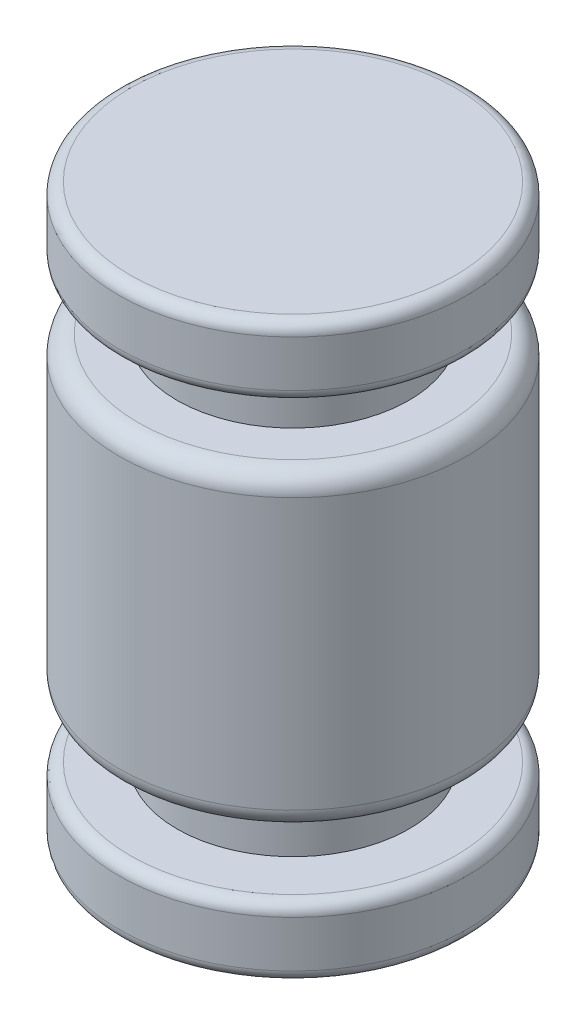
ISO-10303-21;
HEADER;
FILE_DESCRIPTION(('STEP AP214'),'2;1');
FILE_NAME('part.step','',(''),(''),'','','');
FILE_SCHEMA(('AUTOMOTIVE_DESIGN { 1 0 10303 214 1 1 1 1 }'));
ENDSEC;
DATA;
#1=APPLICATION_CONTEXT('core data for automotive mechanical design processes');
#2=APPLICATION_PROTOCOL_DEFINITION('international standard','automotive_design',2000,#1);
#3=PRODUCT_CONTEXT('',#1,'mechanical');
#4=PRODUCT('Part','Part','',(#3));
#5=PRODUCT_RELATED_PRODUCT_CATEGORY('part','',(#4));
#6=PRODUCT_DEFINITION_FORMATION('','',#4);
#7=PRODUCT_DEFINITION_CONTEXT('part definition',#1,'design');
#8=PRODUCT_DEFINITION('design','',#6,#7);
#9=PRODUCT_DEFINITION_SHAPE('','',#8);
#10=(LENGTH_UNIT() NAMED_UNIT(*) SI_UNIT(.MILLI.,.METRE.));
#11=(NAMED_UNIT(*) PLANE_ANGLE_UNIT() SI_UNIT($,.RADIAN.));
#12=(NAMED_UNIT(*) SI_UNIT($,.STERADIAN.) SOLID_ANGLE_UNIT());
#13=UNCERTAINTY_MEASURE_WITH_UNIT(LENGTH_MEASURE(1.E-05),#10,'distance_accuracy_value','');
#14=(GEOMETRIC_REPRESENTATION_CONTEXT(3) GLOBAL_UNCERTAINTY_ASSIGNED_CONTEXT((#13)) GLOBAL_UNIT_ASSIGNED_CONTEXT((#10,
#11,#12)) REPRESENTATION_CONTEXT('',''));
#15=CARTESIAN_POINT('',(0.,0.,0.));
#16=DIRECTION('',(0.,0.,1.));
#17=DIRECTION('',(1.,0.,0.));
#18=AXIS2_PLACEMENT_3D('',#15,#16,#17);
#19=CARTESIAN_POINT('',(0.,-4.,0.));
#20=DIRECTION('',(0.,1.,0.));
#21=DIRECTION('',(0.,0.,1.));
#22=AXIS2_PLACEMENT_3D('',#19,#20,#21);
#23=CYLINDRICAL_SURFACE('',#22,4.5);
#24=CARTESIAN_POINT('',(0.,-3.5,0.));
#25=DIRECTION('',(0.,1.,0.));
#26=DIRECTION('',(0.,0.,1.));
#27=AXIS2_PLACEMENT_3D('',#24,#25,#26);
#28=CIRCLE('',#27,4.5);
#29=CARTESIAN_POINT('',(0.,-3.5,4.5));
#30=VERTEX_POINT('',#29);
#31=EDGE_CURVE('E43',#30,#30,#28,.T.);
#32=ORIENTED_EDGE('',*,*,#31,.T.);
#33=EDGE_LOOP('',(#32));
#34=FACE_BOUND('',#33,.T.);
#35=CARTESIAN_POINT('',(0.,3.5,0.));
#36=DIRECTION('',(0.,1.,0.));
#37=DIRECTION('',(0.,0.,1.));
#38=AXIS2_PLACEMENT_3D('',#35,#36,#37);
#39=CIRCLE('',#38,4.5);
#40=CARTESIAN_POINT('',(0.,3.5,4.5));
#41=VERTEX_POINT('',#40);
#42=EDGE_CURVE('E47',#41,#41,#39,.F.);
#43=ORIENTED_EDGE('',*,*,#42,.T.);
#44=EDGE_LOOP('',(#43));
#45=FACE_BOUND('',#44,.T.);
#46=ADVANCED_FACE('F32',(#34,#45),#23,.T.);
#47=CARTESIAN_POINT('',(0.,-4.,0.));
#48=DIRECTION('',(0.,1.,0.));
#49=DIRECTION('',(0.,0.,1.));
#50=AXIS2_PLACEMENT_3D('',#47,#48,#49);
#51=PLANE('',#50);
#52=CARTESIAN_POINT('',(0.,-4.,0.));
#53=DIRECTION('',(0.,1.,0.));
#54=DIRECTION('',(0.,0.,1.));
#55=AXIS2_PLACEMENT_3D('',#52,#53,#54);
#56=CIRCLE('',#55,4.);
#57=CARTESIAN_POINT('',(0.,-4.,4.));
#58=VERTEX_POINT('',#57);
#59=EDGE_CURVE('E39',#58,#58,#56,.F.);
#60=ORIENTED_EDGE('',*,*,#59,.T.);
#61=EDGE_LOOP('',(#60));
#62=FACE_BOUND('',#61,.T.);
#63=CARTESIAN_POINT('',(0.,-4.,0.));
#64=DIRECTION('',(0.,1.,0.));
#65=DIRECTION('',(0.,0.,1.));
#66=AXIS2_PLACEMENT_3D('',#63,#64,#65);
#67=CIRCLE('',#66,3.);
#68=CARTESIAN_POINT('',(0.,-4.,3.));
#69=VERTEX_POINT('',#68);
#70=EDGE_CURVE('E79',#69,#69,#67,.T.);
#71=ORIENTED_EDGE('',*,*,#70,.T.);
#72=EDGE_LOOP('',(#71));
#73=FACE_BOUND('',#72,.T.);
#74=ADVANCED_FACE('F103',(#62,#73),#51,.F.);
#75=CARTESIAN_POINT('',(0.,4.,0.));
#76=DIRECTION('',(0.,1.,0.));
#77=DIRECTION('',(0.,0.,1.));
#78=AXIS2_PLACEMENT_3D('',#75,#76,#77);
#79=PLANE('',#78);
#80=CARTESIAN_POINT('',(0.,4.,0.));
#81=DIRECTION('',(0.,1.,0.));
#82=DIRECTION('',(0.,0.,1.));
#83=AXIS2_PLACEMENT_3D('',#80,#81,#82);
#84=CIRCLE('',#83,4.);
#85=CARTESIAN_POINT('',(0.,4.,4.));
#86=VERTEX_POINT('',#85);
#87=EDGE_CURVE('E10',#86,#86,#84,.T.);
#88=ORIENTED_EDGE('',*,*,#87,.T.);
#89=EDGE_LOOP('',(#88));
#90=FACE_BOUND('',#89,.T.);
#91=CARTESIAN_POINT('',(0.,4.,0.));
#92=DIRECTION('',(0.,1.,0.));
#93=DIRECTION('',(0.,0.,1.));
#94=AXIS2_PLACEMENT_3D('',#91,#92,#93);
#95=CIRCLE('',#94,3.);
#96=CARTESIAN_POINT('',(0.,4.,3.));
#97=VERTEX_POINT('',#96);
#98=EDGE_CURVE('E76',#97,#97,#95,.T.);
#99=ORIENTED_EDGE('',*,*,#98,.F.);
#100=EDGE_LOOP('',(#99));
#101=FACE_BOUND('',#100,.T.);
#102=ADVANCED_FACE('F94',(#90,#101),#79,.T.);
#103=CARTESIAN_POINT('',(0.,-5.6,0.));
#104=DIRECTION('',(0.,1.,0.));
#105=DIRECTION('',(0.,0.,1.));
#106=AXIS2_PLACEMENT_3D('',#103,#104,#105);
#107=CYLINDRICAL_SURFACE('',#106,3.);
#108=ORIENTED_EDGE('',*,*,#98,.T.);
#109=EDGE_LOOP('',(#108));
#110=FACE_BOUND('',#109,.T.);
#111=CARTESIAN_POINT('',(0.,5.6,0.));
#112=DIRECTION('',(0.,1.,0.));
#113=DIRECTION('',(0.,0.,1.));
#114=AXIS2_PLACEMENT_3D('',#111,#112,#113);
#115=CIRCLE('',#114,3.);
#116=CARTESIAN_POINT('',(0.,5.6,3.));
#117=VERTEX_POINT('',#116);
#118=EDGE_CURVE('E82',#117,#117,#115,.T.);
#119=ORIENTED_EDGE('',*,*,#118,.F.);
#120=EDGE_LOOP('',(#119));
#121=FACE_BOUND('',#120,.T.);
#122=ADVANCED_FACE('F91',(#110,#121),#107,.T.);
#123=CARTESIAN_POINT('',(0.,-5.6,0.));
#124=DIRECTION('',(0.,1.,0.));
#125=DIRECTION('',(0.,0.,1.));
#126=AXIS2_PLACEMENT_3D('',#123,#124,#125);
#127=CIRCLE('',#126,3.);
#128=CARTESIAN_POINT('',(0.,-5.6,3.));
#129=VERTEX_POINT('',#128);
#130=EDGE_CURVE('E83',#129,#129,#127,.T.);
#131=ORIENTED_EDGE('',*,*,#130,.T.);
#132=EDGE_LOOP('',(#131));
#133=FACE_BOUND('',#132,.T.);
#134=ORIENTED_EDGE('',*,*,#70,.F.);
#135=EDGE_LOOP('',(#134));
#136=FACE_BOUND('',#135,.T.);
#137=ADVANCED_FACE('F93',(#133,#136),#107,.T.);
#138=CARTESIAN_POINT('',(0.,7.4,0.));
#139=DIRECTION('',(0.,-1.,0.));
#140=DIRECTION('',(0.,0.,-1.));
#141=AXIS2_PLACEMENT_3D('',#138,#139,#140);
#142=CYLINDRICAL_SURFACE('',#141,4.5);
#143=CARTESIAN_POINT('',(0.,5.9,0.));
#144=DIRECTION('',(0.,1.,0.));
#145=DIRECTION('',(0.,0.,1.));
#146=AXIS2_PLACEMENT_3D('',#143,#144,#145);
#147=CIRCLE('',#146,4.5);
#148=CARTESIAN_POINT('',(0.,5.9,4.5));
#149=VERTEX_POINT('',#148);
#150=EDGE_CURVE('E58',#149,#149,#147,.T.);
#151=ORIENTED_EDGE('',*,*,#150,.T.);
#152=EDGE_LOOP('',(#151));
#153=FACE_BOUND('',#152,.T.);
#154=CARTESIAN_POINT('',(0.,7.1,0.));
#155=DIRECTION('',(0.,1.,0.));
#156=DIRECTION('',(0.,0.,1.));
#157=AXIS2_PLACEMENT_3D('',#154,#155,#156);
#158=CIRCLE('',#157,4.5);
#159=CARTESIAN_POINT('',(0.,7.1,4.5));
#160=VERTEX_POINT('',#159);
#161=EDGE_CURVE('E61',#160,#160,#158,.F.);
#162=ORIENTED_EDGE('',*,*,#161,.T.);
#163=EDGE_LOOP('',(#162));
#164=FACE_BOUND('',#163,.T.);
#165=ADVANCED_FACE('F100',(#153,#164),#142,.T.);
#166=CARTESIAN_POINT('',(0.,7.4,0.));
#167=DIRECTION('',(0.,1.,0.));
#168=DIRECTION('',(0.,0.,1.));
#169=AXIS2_PLACEMENT_3D('',#166,#167,#168);
#170=PLANE('',#169);
#171=CARTESIAN_POINT('',(0.,7.4,0.));
#172=DIRECTION('',(0.,1.,0.));
#173=DIRECTION('',(0.,0.,1.));
#174=AXIS2_PLACEMENT_3D('',#171,#172,#173);
#175=CIRCLE('',#174,4.2);
#176=CARTESIAN_POINT('',(0.,7.4,4.2));
#177=VERTEX_POINT('',#176);
#178=EDGE_CURVE('E52',#177,#177,#175,.T.);
#179=ORIENTED_EDGE('',*,*,#178,.T.);
#180=EDGE_LOOP('',(#179));
#181=FACE_BOUND('',#180,.T.);
#182=ADVANCED_FACE('F173',(#181),#170,.T.);
#183=CARTESIAN_POINT('',(0.,5.6,0.));
#184=DIRECTION('',(0.,1.,0.));
#185=DIRECTION('',(0.,0.,1.));
#186=AXIS2_PLACEMENT_3D('',#183,#184,#185);
#187=PLANE('',#186);
#188=CARTESIAN_POINT('',(0.,5.6,0.));
#189=DIRECTION('',(0.,1.,0.));
#190=DIRECTION('',(0.,0.,1.));
#191=AXIS2_PLACEMENT_3D('',#188,#189,#190);
#192=CIRCLE('',#191,4.2);
#193=CARTESIAN_POINT('',(0.,5.6,4.2));
#194=VERTEX_POINT('',#193);
#195=EDGE_CURVE('E55',#194,#194,#192,.F.);
#196=ORIENTED_EDGE('',*,*,#195,.T.);
#197=EDGE_LOOP('',(#196));
#198=FACE_BOUND('',#197,.T.);
#199=ORIENTED_EDGE('',*,*,#118,.T.);
#200=EDGE_LOOP('',(#199));
#201=FACE_BOUND('',#200,.T.);
#202=ADVANCED_FACE('F89',(#198,#201),#187,.F.);
#203=CARTESIAN_POINT('',(0.,-7.4,0.));
#204=DIRECTION('',(0.,1.,0.));
#205=DIRECTION('',(0.,0.,1.));
#206=AXIS2_PLACEMENT_3D('',#203,#204,#205);
#207=CYLINDRICAL_SURFACE('',#206,4.5);
#208=CARTESIAN_POINT('',(0.,-7.1,0.));
#209=DIRECTION('',(0.,-1.,0.));
#210=DIRECTION('',(0.,0.,-1.));
#211=AXIS2_PLACEMENT_3D('',#208,#209,#210);
#212=CIRCLE('',#211,4.5);
#213=CARTESIAN_POINT('',(0.,-7.1,-4.5));
#214=VERTEX_POINT('',#213);
#215=EDGE_CURVE('E67',#214,#214,#212,.F.);
#216=ORIENTED_EDGE('',*,*,#215,.T.);
#217=EDGE_LOOP('',(#216));
#218=FACE_BOUND('',#217,.T.);
#219=CARTESIAN_POINT('',(0.,-5.9,0.));
#220=DIRECTION('',(0.,-1.,0.));
#221=DIRECTION('',(0.,0.,-1.));
#222=AXIS2_PLACEMENT_3D('',#219,#220,#221);
#223=CIRCLE('',#222,4.5);
#224=CARTESIAN_POINT('',(0.,-5.9,-4.5));
#225=VERTEX_POINT('',#224);
#226=EDGE_CURVE('E70',#225,#225,#223,.T.);
#227=ORIENTED_EDGE('',*,*,#226,.T.);
#228=EDGE_LOOP('',(#227));
#229=FACE_BOUND('',#228,.T.);
#230=ADVANCED_FACE('F158',(#218,#229),#207,.T.);
#231=CARTESIAN_POINT('',(0.,-7.4,0.));
#232=DIRECTION('',(0.,-1.,0.));
#233=DIRECTION('',(0.,0.,-1.));
#234=AXIS2_PLACEMENT_3D('',#231,#232,#233);
#235=PLANE('',#234);
#236=CARTESIAN_POINT('',(0.,-7.4,0.));
#237=DIRECTION('',(0.,-1.,0.));
#238=DIRECTION('',(0.,0.,-1.));
#239=AXIS2_PLACEMENT_3D('',#236,#237,#238);
#240=CIRCLE('',#239,4.2);
#241=CARTESIAN_POINT('',(0.,-7.4,-4.2));
#242=VERTEX_POINT('',#241);
#243=EDGE_CURVE('E73',#242,#242,#240,.T.);
#244=ORIENTED_EDGE('',*,*,#243,.T.);
#245=EDGE_LOOP('',(#244));
#246=FACE_BOUND('',#245,.T.);
#247=ADVANCED_FACE('F150',(#246),#235,.T.);
#248=CARTESIAN_POINT('',(0.,-5.6,0.));
#249=DIRECTION('',(0.,-1.,0.));
#250=DIRECTION('',(0.,0.,-1.));
#251=AXIS2_PLACEMENT_3D('',#248,#249,#250);
#252=PLANE('',#251);
#253=CARTESIAN_POINT('',(0.,-5.6,0.));
#254=DIRECTION('',(0.,-1.,0.));
#255=DIRECTION('',(0.,0.,-1.));
#256=AXIS2_PLACEMENT_3D('',#253,#254,#255);
#257=CIRCLE('',#256,4.2);
#258=CARTESIAN_POINT('',(0.,-5.6,-4.2));
#259=VERTEX_POINT('',#258);
#260=EDGE_CURVE('E64',#259,#259,#257,.F.);
#261=ORIENTED_EDGE('',*,*,#260,.T.);
#262=EDGE_LOOP('',(#261));
#263=FACE_BOUND('',#262,.T.);
#264=ORIENTED_EDGE('',*,*,#130,.F.);
#265=EDGE_LOOP('',(#264));
#266=FACE_BOUND('',#265,.T.);
#267=ADVANCED_FACE('F119',(#263,#266),#252,.F.);
#268=CARTESIAN_POINT('',(0.,-7.1,0.));
#269=DIRECTION('',(0.,-1.,0.));
#270=DIRECTION('',(0.,0.,-1.));
#271=AXIS2_PLACEMENT_3D('',#268,#269,#270);
#272=TOROIDAL_SURFACE('',#271,4.2,0.3);
#273=ORIENTED_EDGE('',*,*,#215,.F.);
#274=EDGE_LOOP('',(#273));
#275=FACE_BOUND('',#274,.T.);
#276=ORIENTED_EDGE('',*,*,#243,.F.);
#277=EDGE_LOOP('',(#276));
#278=FACE_BOUND('',#277,.T.);
#279=ADVANCED_FACE('F115',(#275,#278),#272,.T.);
#280=CARTESIAN_POINT('',(0.,-5.9,0.));
#281=DIRECTION('',(0.,-1.,0.));
#282=DIRECTION('',(0.,0.,-1.));
#283=AXIS2_PLACEMENT_3D('',#280,#281,#282);
#284=TOROIDAL_SURFACE('',#283,4.2,0.3);
#285=ORIENTED_EDGE('',*,*,#260,.F.);
#286=EDGE_LOOP('',(#285));
#287=FACE_BOUND('',#286,.T.);
#288=ORIENTED_EDGE('',*,*,#226,.F.);
#289=EDGE_LOOP('',(#288));
#290=FACE_BOUND('',#289,.T.);
#291=ADVANCED_FACE('F118',(#287,#290),#284,.T.);
#292=CARTESIAN_POINT('',(0.,5.9,0.));
#293=DIRECTION('',(0.,1.,0.));
#294=DIRECTION('',(0.,0.,1.));
#295=AXIS2_PLACEMENT_3D('',#292,#293,#294);
#296=TOROIDAL_SURFACE('',#295,4.2,0.3);
#297=ORIENTED_EDGE('',*,*,#195,.F.);
#298=EDGE_LOOP('',(#297));
#299=FACE_BOUND('',#298,.T.);
#300=ORIENTED_EDGE('',*,*,#150,.F.);
#301=EDGE_LOOP('',(#300));
#302=FACE_BOUND('',#301,.T.);
#303=ADVANCED_FACE('F123',(#299,#302),#296,.T.);
#304=CARTESIAN_POINT('',(0.,7.1,0.));
#305=DIRECTION('',(0.,1.,0.));
#306=DIRECTION('',(0.,0.,1.));
#307=AXIS2_PLACEMENT_3D('',#304,#305,#306);
#308=TOROIDAL_SURFACE('',#307,4.2,0.3);
#309=ORIENTED_EDGE('',*,*,#161,.F.);
#310=EDGE_LOOP('',(#309));
#311=FACE_BOUND('',#310,.T.);
#312=ORIENTED_EDGE('',*,*,#178,.F.);
#313=EDGE_LOOP('',(#312));
#314=FACE_BOUND('',#313,.T.);
#315=ADVANCED_FACE('F127',(#311,#314),#308,.T.);
#316=CARTESIAN_POINT('',(0.,-3.5,0.));
#317=DIRECTION('',(0.,1.,0.));
#318=DIRECTION('',(0.,0.,1.));
#319=AXIS2_PLACEMENT_3D('',#316,#317,#318);
#320=TOROIDAL_SURFACE('',#319,4.,0.5);
#321=ORIENTED_EDGE('',*,*,#59,.F.);
#322=EDGE_LOOP('',(#321));
#323=FACE_BOUND('',#322,.T.);
#324=ORIENTED_EDGE('',*,*,#31,.F.);
#325=EDGE_LOOP('',(#324));
#326=FACE_BOUND('',#325,.T.);
#327=ADVANCED_FACE('F130',(#323,#326),#320,.T.);
#328=CARTESIAN_POINT('',(0.,3.5,0.));
#329=DIRECTION('',(0.,1.,0.));
#330=DIRECTION('',(0.,0.,1.));
#331=AXIS2_PLACEMENT_3D('',#328,#329,#330);
#332=TOROIDAL_SURFACE('',#331,4.,0.5);
#333=ORIENTED_EDGE('',*,*,#42,.F.);
#334=EDGE_LOOP('',(#333));
#335=FACE_BOUND('',#334,.T.);
#336=ORIENTED_EDGE('',*,*,#87,.F.);
#337=EDGE_LOOP('',(#336));
#338=FACE_BOUND('',#337,.T.);
#339=ADVANCED_FACE('F34',(#335,#338),#332,.T.);
#340=CLOSED_SHELL('',(#46,#74,#102,#122,#137,#165,#182,#202,#230,#247,#267,#279,#291,#303,#315,
#327,#339));
#341=MANIFOLD_SOLID_BREP('B2',#340);
#342=ADVANCED_BREP_SHAPE_REPRESENTATION('',(#18,#341),#14);
#343=SHAPE_DEFINITION_REPRESENTATION(#9,#342);
ENDSEC;
END-ISO-10303-21;
